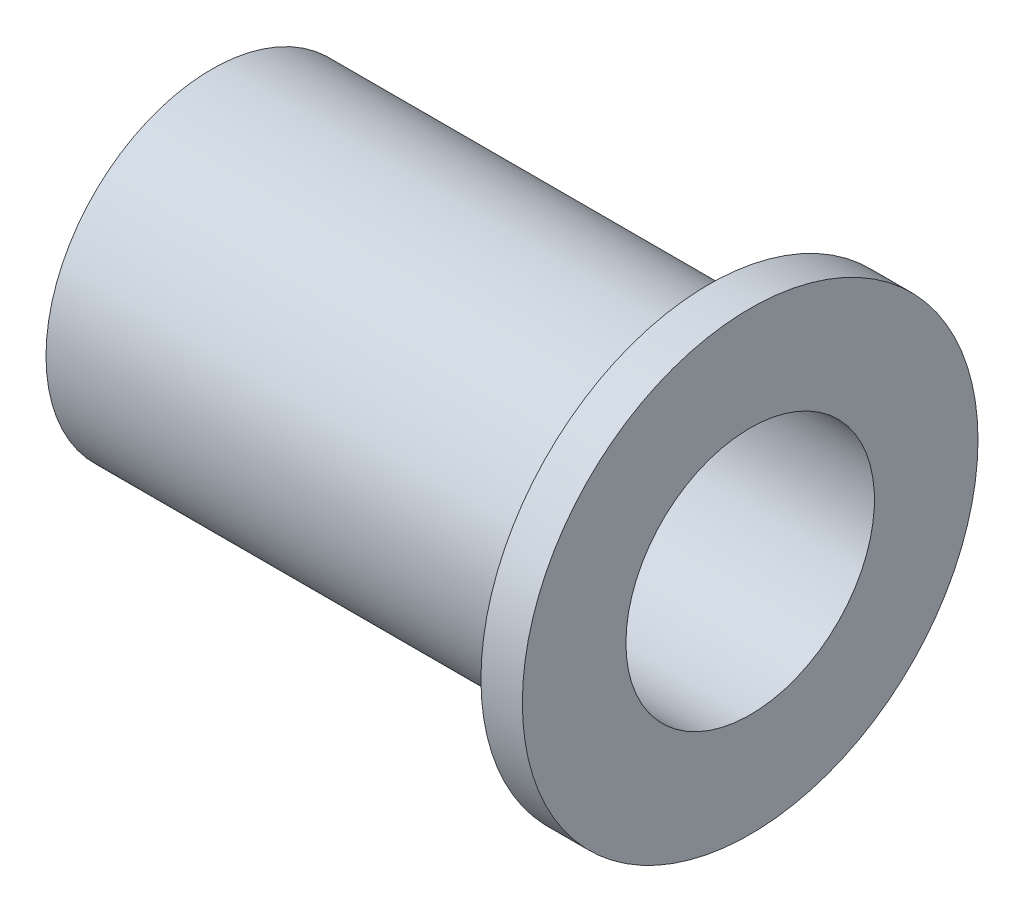
ISO-10303-21;
HEADER;
FILE_DESCRIPTION(('STEP AP214'),'2;1');
FILE_NAME('part.step','',(''),(''),'','','');
FILE_SCHEMA(('AUTOMOTIVE_DESIGN { 1 0 10303 214 1 1 1 1 }'));
ENDSEC;
DATA;
#1=APPLICATION_CONTEXT('core data for automotive mechanical design processes');
#2=APPLICATION_PROTOCOL_DEFINITION('international standard','automotive_design',2000,#1);
#3=PRODUCT_CONTEXT('',#1,'mechanical');
#4=PRODUCT('Part','Part','',(#3));
#5=PRODUCT_RELATED_PRODUCT_CATEGORY('part','',(#4));
#6=PRODUCT_DEFINITION_FORMATION('','',#4);
#7=PRODUCT_DEFINITION_CONTEXT('part definition',#1,'design');
#8=PRODUCT_DEFINITION('design','',#6,#7);
#9=PRODUCT_DEFINITION_SHAPE('','',#8);
#10=(LENGTH_UNIT() NAMED_UNIT(*) SI_UNIT(.MILLI.,.METRE.));
#11=(NAMED_UNIT(*) PLANE_ANGLE_UNIT() SI_UNIT($,.RADIAN.));
#12=(NAMED_UNIT(*) SI_UNIT($,.STERADIAN.) SOLID_ANGLE_UNIT());
#13=UNCERTAINTY_MEASURE_WITH_UNIT(LENGTH_MEASURE(1.E-05),#10,'distance_accuracy_value','');
#14=(GEOMETRIC_REPRESENTATION_CONTEXT(3) GLOBAL_UNCERTAINTY_ASSIGNED_CONTEXT((#13)) GLOBAL_UNIT_ASSIGNED_CONTEXT((#10,
#11,#12)) REPRESENTATION_CONTEXT('',''));
#15=CARTESIAN_POINT('',(0.,0.,0.));
#16=DIRECTION('',(0.,0.,1.));
#17=DIRECTION('',(1.,0.,0.));
#18=AXIS2_PLACEMENT_3D('',#15,#16,#17);
#19=CARTESIAN_POINT('',(0.,0.,0.));
#20=DIRECTION('',(-1.,0.,0.));
#21=DIRECTION('',(0.,0.,1.));
#22=AXIS2_PLACEMENT_3D('',#19,#20,#21);
#23=CYLINDRICAL_SURFACE('',#22,4.76249999999999);
#24=CARTESIAN_POINT('',(20.6375,0.,0.));
#25=DIRECTION('',(-1.,0.,0.));
#26=DIRECTION('',(0.,0.,1.));
#27=AXIS2_PLACEMENT_3D('',#24,#25,#26);
#28=CIRCLE('',#27,4.76249999999999);
#29=CARTESIAN_POINT('',(20.6375,0.,4.76249999999999));
#30=VERTEX_POINT('',#29);
#31=EDGE_CURVE('E53',#30,#30,#28,.T.);
#32=ORIENTED_EDGE('',*,*,#31,.F.);
#33=EDGE_LOOP('',(#32));
#34=FACE_BOUND('',#33,.T.);
#35=CARTESIAN_POINT('',(0.,0.,0.));
#36=DIRECTION('',(-1.,0.,0.));
#37=DIRECTION('',(0.,0.,1.));
#38=AXIS2_PLACEMENT_3D('',#35,#36,#37);
#39=CIRCLE('',#38,4.76249999999999);
#40=CARTESIAN_POINT('',(0.,0.,4.76249999999999));
#41=VERTEX_POINT('',#40);
#42=EDGE_CURVE('E10',#41,#41,#39,.T.);
#43=ORIENTED_EDGE('',*,*,#42,.T.);
#44=EDGE_LOOP('',(#43));
#45=FACE_BOUND('',#44,.T.);
#46=ADVANCED_FACE('F31',(#34,#45),#23,.F.);
#47=CARTESIAN_POINT('',(0.,0.,-4.76249999999999));
#48=DIRECTION('',(1.,0.,0.));
#49=DIRECTION('',(0.,0.,-1.));
#50=AXIS2_PLACEMENT_3D('',#47,#48,#49);
#51=PLANE('',#50);
#52=ORIENTED_EDGE('',*,*,#42,.F.);
#53=EDGE_LOOP('',(#52));
#54=FACE_BOUND('',#53,.T.);
#55=CARTESIAN_POINT('',(0.,0.,0.));
#56=DIRECTION('',(-1.,0.,0.));
#57=DIRECTION('',(0.,0.,1.));
#58=AXIS2_PLACEMENT_3D('',#55,#56,#57);
#59=CIRCLE('',#58,6.35);
#60=CARTESIAN_POINT('',(0.,0.,6.35));
#61=VERTEX_POINT('',#60);
#62=EDGE_CURVE('E37',#61,#61,#59,.T.);
#63=ORIENTED_EDGE('',*,*,#62,.T.);
#64=EDGE_LOOP('',(#63));
#65=FACE_BOUND('',#64,.T.);
#66=ADVANCED_FACE('F60',(#54,#65),#51,.F.);
#67=CARTESIAN_POINT('',(0.,0.,0.));
#68=DIRECTION('',(-1.,0.,0.));
#69=DIRECTION('',(0.,0.,1.));
#70=AXIS2_PLACEMENT_3D('',#67,#68,#69);
#71=CYLINDRICAL_SURFACE('',#70,6.35);
#72=ORIENTED_EDGE('',*,*,#62,.F.);
#73=EDGE_LOOP('',(#72));
#74=FACE_BOUND('',#73,.T.);
#75=CARTESIAN_POINT('',(19.05,0.,0.));
#76=DIRECTION('',(-1.,0.,0.));
#77=DIRECTION('',(0.,0.,1.));
#78=AXIS2_PLACEMENT_3D('',#75,#76,#77);
#79=CIRCLE('',#78,6.35);
#80=CARTESIAN_POINT('',(19.05,0.,6.35));
#81=VERTEX_POINT('',#80);
#82=EDGE_CURVE('E41',#81,#81,#79,.T.);
#83=ORIENTED_EDGE('',*,*,#82,.T.);
#84=EDGE_LOOP('',(#83));
#85=FACE_BOUND('',#84,.T.);
#86=ADVANCED_FACE('F64',(#74,#85),#71,.T.);
#87=CARTESIAN_POINT('',(19.05,0.,-6.35));
#88=DIRECTION('',(1.,0.,0.));
#89=DIRECTION('',(0.,0.,-1.));
#90=AXIS2_PLACEMENT_3D('',#87,#88,#89);
#91=PLANE('',#90);
#92=ORIENTED_EDGE('',*,*,#82,.F.);
#93=EDGE_LOOP('',(#92));
#94=FACE_BOUND('',#93,.T.);
#95=CARTESIAN_POINT('',(19.05,0.,0.));
#96=DIRECTION('',(-1.,0.,0.));
#97=DIRECTION('',(0.,0.,1.));
#98=AXIS2_PLACEMENT_3D('',#95,#96,#97);
#99=CIRCLE('',#98,8.73125);
#100=CARTESIAN_POINT('',(19.05,0.,8.73125));
#101=VERTEX_POINT('',#100);
#102=EDGE_CURVE('E45',#101,#101,#99,.T.);
#103=ORIENTED_EDGE('',*,*,#102,.T.);
#104=EDGE_LOOP('',(#103));
#105=FACE_BOUND('',#104,.T.);
#106=ADVANCED_FACE('F69',(#94,#105),#91,.F.);
#107=CARTESIAN_POINT('',(0.,0.,0.));
#108=DIRECTION('',(-1.,0.,0.));
#109=DIRECTION('',(0.,0.,1.));
#110=AXIS2_PLACEMENT_3D('',#107,#108,#109);
#111=CYLINDRICAL_SURFACE('',#110,8.73125);
#112=ORIENTED_EDGE('',*,*,#102,.F.);
#113=EDGE_LOOP('',(#112));
#114=FACE_BOUND('',#113,.T.);
#115=CARTESIAN_POINT('',(20.6375,0.,0.));
#116=DIRECTION('',(-1.,0.,0.));
#117=DIRECTION('',(0.,0.,1.));
#118=AXIS2_PLACEMENT_3D('',#115,#116,#117);
#119=CIRCLE('',#118,8.73125);
#120=CARTESIAN_POINT('',(20.6375,0.,8.73125));
#121=VERTEX_POINT('',#120);
#122=EDGE_CURVE('E50',#121,#121,#119,.T.);
#123=ORIENTED_EDGE('',*,*,#122,.T.);
#124=EDGE_LOOP('',(#123));
#125=FACE_BOUND('',#124,.T.);
#126=ADVANCED_FACE('F75',(#114,#125),#111,.T.);
#127=CARTESIAN_POINT('',(20.6375,0.,-8.73125));
#128=DIRECTION('',(-1.,0.,0.));
#129=DIRECTION('',(0.,0.,1.));
#130=AXIS2_PLACEMENT_3D('',#127,#128,#129);
#131=PLANE('',#130);
#132=ORIENTED_EDGE('',*,*,#122,.F.);
#133=EDGE_LOOP('',(#132));
#134=FACE_BOUND('',#133,.T.);
#135=ORIENTED_EDGE('',*,*,#31,.T.);
#136=EDGE_LOOP('',(#135));
#137=FACE_BOUND('',#136,.T.);
#138=ADVANCED_FACE('F57',(#134,#137),#131,.F.);
#139=CLOSED_SHELL('',(#46,#66,#86,#106,#126,#138));
#140=MANIFOLD_SOLID_BREP('B2',#139);
#141=ADVANCED_BREP_SHAPE_REPRESENTATION('',(#18,#140),#14);
#142=SHAPE_DEFINITION_REPRESENTATION(#9,#141);
ENDSEC;
END-ISO-10303-21;
